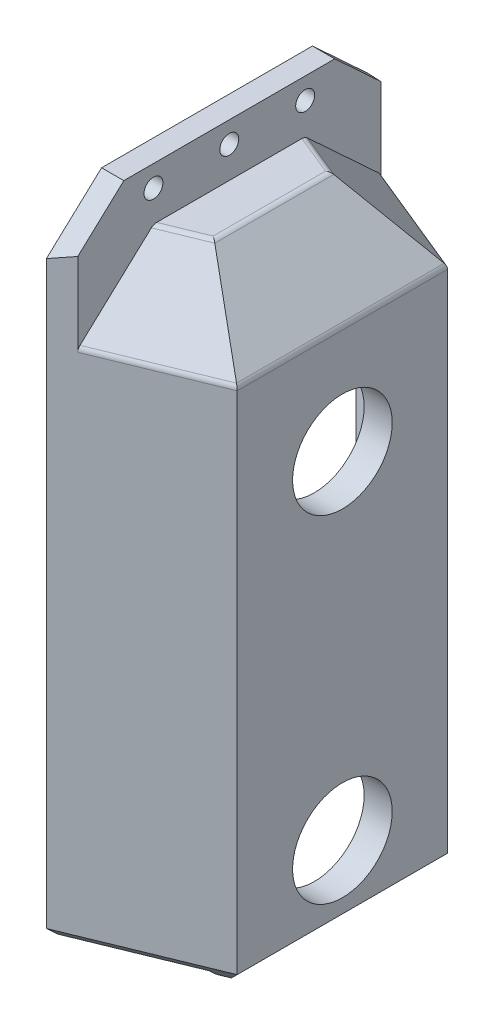
ISO-10303-21;
HEADER;
FILE_DESCRIPTION(('STEP AP214'),'2;1');
FILE_NAME('part.step','',(''),(''),'','','');
FILE_SCHEMA(('AUTOMOTIVE_DESIGN { 1 0 10303 214 1 1 1 1 }'));
ENDSEC;
DATA;
#1=APPLICATION_CONTEXT('core data for automotive mechanical design processes');
#2=APPLICATION_PROTOCOL_DEFINITION('international standard','automotive_design',2000,#1);
#3=PRODUCT_CONTEXT('',#1,'mechanical');
#4=PRODUCT('Part','Part','',(#3));
#5=PRODUCT_RELATED_PRODUCT_CATEGORY('part','',(#4));
#6=PRODUCT_DEFINITION_FORMATION('','',#4);
#7=PRODUCT_DEFINITION_CONTEXT('part definition',#1,'design');
#8=PRODUCT_DEFINITION('design','',#6,#7);
#9=PRODUCT_DEFINITION_SHAPE('','',#8);
#10=(LENGTH_UNIT() NAMED_UNIT(*) SI_UNIT(.MILLI.,.METRE.));
#11=(NAMED_UNIT(*) PLANE_ANGLE_UNIT() SI_UNIT($,.RADIAN.));
#12=(NAMED_UNIT(*) SI_UNIT($,.STERADIAN.) SOLID_ANGLE_UNIT());
#13=UNCERTAINTY_MEASURE_WITH_UNIT(LENGTH_MEASURE(1.E-05),#10,'distance_accuracy_value','');
#14=(GEOMETRIC_REPRESENTATION_CONTEXT(3) GLOBAL_UNCERTAINTY_ASSIGNED_CONTEXT((#13)) GLOBAL_UNIT_ASSIGNED_CONTEXT((#10,
#11,#12)) REPRESENTATION_CONTEXT('',''));
#15=CARTESIAN_POINT('',(0.,0.,0.));
#16=DIRECTION('',(0.,0.,1.));
#17=DIRECTION('',(1.,0.,0.));
#18=AXIS2_PLACEMENT_3D('',#15,#16,#17);
#19=CARTESIAN_POINT('',(3.175,7.5,-19.402609778092));
#20=DIRECTION('',(0.,1.,0.));
#21=DIRECTION('',(0.,0.,1.));
#22=AXIS2_PLACEMENT_3D('',#19,#20,#21);
#23=PLANE('',#22);
#24=DIRECTION('',(0.,0.,1.));
#25=VECTOR('',#24,1.);
#26=CARTESIAN_POINT('',(8.88578643762691,7.5,-19.402609778092));
#27=LINE('',#26,#25);
#28=CARTESIAN_POINT('',(8.88578643762691,7.5,8.01080265694155));
#29=VERTEX_POINT('',#28);
#30=CARTESIAN_POINT('',(8.88578643762691,7.5,-8.01080265694154));
#31=VERTEX_POINT('',#30);
#32=EDGE_CURVE('E309',#29,#31,#27,.F.);
#33=ORIENTED_EDGE('',*,*,#32,.T.);
#34=DIRECTION('',(0.925426676120117,0.,0.378926730549948));
#35=VECTOR('',#34,1.);
#36=CARTESIAN_POINT('',(0.000233412048950173,7.5,-11.6490958291533));
#37=LINE('',#36,#35);
#38=CARTESIAN_POINT('',(3.175,7.5,-10.3491506746921));
#39=VERTEX_POINT('',#38);
#40=EDGE_CURVE('E311',#31,#39,#37,.F.);
#41=ORIENTED_EDGE('',*,*,#40,.T.);
#42=DIRECTION('',(0.,0.,1.));
#43=VECTOR('',#42,1.);
#44=CARTESIAN_POINT('',(3.175,7.5,-19.402609778092));
#45=LINE('',#44,#43);
#46=CARTESIAN_POINT('',(3.175,7.5,10.3491506746921));
#47=VERTEX_POINT('',#46);
#48=EDGE_CURVE('E232',#39,#47,#45,.T.);
#49=ORIENTED_EDGE('',*,*,#48,.T.);
#50=DIRECTION('',(0.925426676120117,0.,-0.378926730549948));
#51=VECTOR('',#50,1.);
#52=CARTESIAN_POINT('',(13.6080172522402,7.5,6.07723025227988));
#53=LINE('',#52,#51);
#54=EDGE_CURVE('E307',#47,#29,#53,.T.);
#55=ORIENTED_EDGE('',*,*,#54,.T.);
#56=EDGE_LOOP('',(#33,#41,#49,#55));
#57=FACE_BOUND('',#56,.T.);
#58=ADVANCED_FACE('F41',(#57),#23,.T.);
#59=CARTESIAN_POINT('',(0.,-2.50000000000004,22.902609778092));
#60=DIRECTION('',(0.267941660744716,0.707106781186546,0.654375478175463));
#61=DIRECTION('',(0.925426676120117,0.,-0.378926730549948));
#62=AXIS2_PLACEMENT_3D('',#59,#60,#61);
#63=PLANE('',#62);
#64=DIRECTION('',(0.,-0.679210724111777,0.733943316783766));
#65=VECTOR('',#64,1.);
#66=CARTESIAN_POINT('',(3.175,-3.14807312601304,22.302865619203));
#67=LINE('',#66,#65);
#68=CARTESIAN_POINT('',(3.175,7.20710678118655,11.1132379864509));
#69=VERTEX_POINT('',#68);
#70=CARTESIAN_POINT('',(3.175,-2.20710678118658,21.2860737229812));
#71=VERTEX_POINT('',#70);
#72=EDGE_CURVE('E237',#69,#71,#67,.T.);
#73=ORIENTED_EDGE('',*,*,#72,.T.);
#74=DIRECTION('',(-0.925426676120117,0.,0.378926730549948));
#75=VECTOR('',#74,1.);
#76=CARTESIAN_POINT('',(19.1890149301948,-2.20710678118658,14.7289488020553));
#77=LINE('',#76,#75);
#78=CARTESIAN_POINT('',(19.0071067811865,-2.20710678118657,14.8034332122661));
#79=VERTEX_POINT('',#78);
#80=EDGE_CURVE('E343',#71,#79,#77,.F.);
#81=ORIENTED_EDGE('',*,*,#80,.T.);
#82=DIRECTION('',(-0.638823976736833,0.638823976736836,-0.428728181360023));
#83=VECTOR('',#82,1.);
#84=CARTESIAN_POINT('',(1.71582840770105,15.084171592299,3.19889330704541));
#85=LINE('',#84,#83);
#86=CARTESIAN_POINT('',(9.59289321881345,7.20710678118655,8.48535686180093));
#87=VERTEX_POINT('',#86);
#88=EDGE_CURVE('E295',#87,#79,#85,.F.);
#89=ORIENTED_EDGE('',*,*,#88,.F.);
#90=DIRECTION('',(0.925426676120117,0.,-0.378926730549948));
#91=VECTOR('',#90,1.);
#92=CARTESIAN_POINT('',(-3.67828223569425,7.20710678118655,13.9193942148355));
#93=LINE('',#92,#91);
#94=EDGE_CURVE('E318',#87,#69,#93,.F.);
#95=ORIENTED_EDGE('',*,*,#94,.T.);
#96=EDGE_LOOP('',(#73,#81,#89,#95));
#97=FACE_BOUND('',#96,.T.);
#98=ADVANCED_FACE('F430',(#97),#63,.T.);
#99=CARTESIAN_POINT('',(0.157190002988433,7.5,-12.0324201093841));
#100=DIRECTION('',(-0.267941660744716,-0.707106781186546,0.654375478175462));
#101=DIRECTION('',(-0.925426676120117,0.,-0.378926730549948));
#102=AXIS2_PLACEMENT_3D('',#99,#100,#101);
#103=PLANE('',#102);
#104=DIRECTION('',(-0.638823976736833,0.638823976736836,0.428728181360024));
#105=VECTOR('',#104,1.);
#106=CARTESIAN_POINT('',(12.3438734094776,4.45612659052238,-10.331597417964));
#107=LINE('',#106,#105);
#108=CARTESIAN_POINT('',(9.59289321881346,7.20710678118655,-8.48535686180092));
#109=VERTEX_POINT('',#108);
#110=CARTESIAN_POINT('',(19.0071067811866,-2.20710678118658,-14.8034332122661));
#111=VERTEX_POINT('',#110);
#112=EDGE_CURVE('E240',#109,#111,#107,.F.);
#113=ORIENTED_EDGE('',*,*,#112,.T.);
#114=DIRECTION('',(0.925426676120117,0.,0.378926730549948));
#115=VECTOR('',#114,1.);
#116=CARTESIAN_POINT('',(3.83547223868268,-2.20710678118659,-21.0156356726406));
#117=LINE('',#116,#115);
#118=CARTESIAN_POINT('',(3.175,-2.20710678118658,-21.2860737229812));
#119=VERTEX_POINT('',#118);
#120=EDGE_CURVE('E334',#111,#119,#117,.F.);
#121=ORIENTED_EDGE('',*,*,#120,.T.);
#122=DIRECTION('',(0.,-0.679210724111777,-0.733943316783766));
#123=VECTOR('',#122,1.);
#124=CARTESIAN_POINT('',(3.175,6.88401210756644,-11.4623684815591));
#125=LINE('',#124,#123);
#126=CARTESIAN_POINT('',(3.175,7.20710678118655,-11.1132379864509));
#127=VERTEX_POINT('',#126);
#128=EDGE_CURVE('E291',#119,#127,#125,.F.);
#129=ORIENTED_EDGE('',*,*,#128,.T.);
#130=DIRECTION('',(-0.925426676120117,0.,-0.378926730549948));
#131=VECTOR('',#130,1.);
#132=CARTESIAN_POINT('',(0.268175072793666,7.20710678118655,-12.3034713073288));
#133=LINE('',#132,#131);
#134=EDGE_CURVE('E314',#127,#109,#133,.F.);
#135=ORIENTED_EDGE('',*,*,#134,.T.);
#136=EDGE_LOOP('',(#113,#121,#129,#135));
#137=FACE_BOUND('',#136,.T.);
#138=ADVANCED_FACE('F450',(#137),#103,.F.);
#139=CARTESIAN_POINT('',(19.3,-2.5,15.));
#140=DIRECTION('',(0.,1.,0.));
#141=DIRECTION('',(0.,0.,1.));
#142=AXIS2_PLACEMENT_3D('',#139,#140,#141);
#143=PLANE('',#142);
#144=DIRECTION('',(0.925426676120117,0.,0.378926730549948));
#145=VECTOR('',#144,1.);
#146=CARTESIAN_POINT('',(13.4053663472503,-2.5,-10.3728666193994));
#147=LINE('',#146,#145);
#148=CARTESIAN_POINT('',(0.,-2.5,-15.8618499963261));
#149=VERTEX_POINT('',#148);
#150=CARTESIAN_POINT('',(10.3,-2.5,-11.6443950370335));
#151=VERTEX_POINT('',#150);
#152=EDGE_CURVE('E276',#149,#151,#147,.T.);
#153=ORIENTED_EDGE('',*,*,#152,.T.);
#154=DIRECTION('',(0.,0.,1.));
#155=VECTOR('',#154,1.);
#156=CARTESIAN_POINT('',(10.3,-2.5,15.));
#157=LINE('',#156,#155);
#158=CARTESIAN_POINT('',(10.3,-2.5,11.6443950370335));
#159=VERTEX_POINT('',#158);
#160=EDGE_CURVE('E274',#151,#159,#157,.T.);
#161=ORIENTED_EDGE('',*,*,#160,.T.);
#162=DIRECTION('',(-0.925426676120117,0.,0.378926730549948));
#163=VECTOR('',#162,1.);
#164=CARTESIAN_POINT('',(-1.89463365274974,-2.5,16.6376298113584));
#165=LINE('',#164,#163);
#166=CARTESIAN_POINT('',(0.,-2.5,15.8618499963261));
#167=VERTEX_POINT('',#166);
#168=EDGE_CURVE('E278',#159,#167,#165,.T.);
#169=ORIENTED_EDGE('',*,*,#168,.T.);
#170=DIRECTION('',(0.,0.,-1.));
#171=VECTOR('',#170,1.);
#172=CARTESIAN_POINT('',(0.,-2.5,15.));
#173=LINE('',#172,#171);
#174=EDGE_CURVE('E264',#167,#149,#173,.T.);
#175=ORIENTED_EDGE('',*,*,#174,.T.);
#176=EDGE_LOOP('',(#153,#161,#169,#175));
#177=FACE_BOUND('',#176,.T.);
#178=ADVANCED_FACE('F482',(#177),#143,.F.);
#179=CARTESIAN_POINT('',(19.3,0.,0.));
#180=DIRECTION('',(1.,0.,0.));
#181=DIRECTION('',(0.,0.,-1.));
#182=AXIS2_PLACEMENT_3D('',#179,#180,#181);
#183=PLANE('',#182);
#184=CARTESIAN_POINT('',(19.3,-17.9000000000868,-2.03531101694576E-06));
#185=DIRECTION('',(1.,0.,0.));
#186=DIRECTION('',(0.,0.,-1.));
#187=AXIS2_PLACEMENT_3D('',#184,#185,#186);
#188=CIRCLE('',#187,7.1);
#189=CARTESIAN_POINT('',(19.3,-17.9000000000868,-7.10000203531102));
#190=VERTEX_POINT('',#189);
#191=EDGE_CURVE('E247',#190,#190,#188,.T.);
#192=ORIENTED_EDGE('',*,*,#191,.F.);
#193=EDGE_LOOP('',(#192));
#194=FACE_BOUND('',#193,.T.);
#195=CARTESIAN_POINT('',(19.3,-65.9000000000868,1.30200223754135E-07));
#196=DIRECTION('',(1.,0.,0.));
#197=DIRECTION('',(0.,0.,-1.));
#198=AXIS2_PLACEMENT_3D('',#195,#196,#197);
#199=CIRCLE('',#198,7.1);
#200=CARTESIAN_POINT('',(19.3,-65.9000000000868,-7.09999986979977));
#201=VERTEX_POINT('',#200);
#202=EDGE_CURVE('E251',#201,#201,#199,.T.);
#203=ORIENTED_EDGE('',*,*,#202,.F.);
#204=EDGE_LOOP('',(#203));
#205=FACE_BOUND('',#204,.T.);
#206=DIRECTION('',(0.,-1.,0.));
#207=VECTOR('',#206,1.);
#208=CARTESIAN_POINT('',(19.3,2.5,15.));
#209=LINE('',#208,#207);
#210=CARTESIAN_POINT('',(19.3,-2.91421356237313,15.));
#211=VERTEX_POINT('',#210);
#212=CARTESIAN_POINT('',(19.3,-75.,15.));
#213=VERTEX_POINT('',#212);
#214=EDGE_CURVE('E265',#211,#213,#209,.T.);
#215=ORIENTED_EDGE('',*,*,#214,.T.);
#216=DIRECTION('',(0.,0.,-1.));
#217=VECTOR('',#216,1.);
#218=CARTESIAN_POINT('',(19.3,-75.,-15.));
#219=LINE('',#218,#217);
#220=CARTESIAN_POINT('',(19.3,-75.,-15.));
#221=VERTEX_POINT('',#220);
#222=EDGE_CURVE('E371',#213,#221,#219,.T.);
#223=ORIENTED_EDGE('',*,*,#222,.T.);
#224=DIRECTION('',(0.,1.,0.));
#225=VECTOR('',#224,1.);
#226=CARTESIAN_POINT('',(19.3,2.5,-15.));
#227=LINE('',#226,#225);
#228=CARTESIAN_POINT('',(19.3,-2.91421356237313,-15.));
#229=VERTEX_POINT('',#228);
#230=EDGE_CURVE('E267',#221,#229,#227,.T.);
#231=ORIENTED_EDGE('',*,*,#230,.T.);
#232=DIRECTION('',(0.,0.,-1.));
#233=VECTOR('',#232,1.);
#234=CARTESIAN_POINT('',(19.3,-2.91421356237313,0.));
#235=LINE('',#234,#233);
#236=EDGE_CURVE('E336',#229,#211,#235,.F.);
#237=ORIENTED_EDGE('',*,*,#236,.T.);
#238=EDGE_LOOP('',(#215,#223,#231,#237));
#239=FACE_BOUND('',#238,.T.);
#240=ADVANCED_FACE('F419',(#194,#205,#239),#183,.T.);
#241=CARTESIAN_POINT('',(0.,0.,0.));
#242=DIRECTION('',(1.,0.,0.));
#243=DIRECTION('',(0.,0.,-1.));
#244=AXIS2_PLACEMENT_3D('',#241,#242,#243);
#245=PLANE('',#244);
#246=CARTESIAN_POINT('',(0.,11.9609325831868,-10.8186055606053));
#247=DIRECTION('',(1.,0.,0.));
#248=DIRECTION('',(0.,0.,-1.));
#249=AXIS2_PLACEMENT_3D('',#246,#247,#248);
#250=CIRCLE('',#249,1.35);
#251=CARTESIAN_POINT('',(0.,11.9609325831868,-12.1686055606053));
#252=VERTEX_POINT('',#251);
#253=EDGE_CURVE('E388',#252,#252,#250,.T.);
#254=ORIENTED_EDGE('',*,*,#253,.T.);
#255=EDGE_LOOP('',(#254));
#256=FACE_BOUND('',#255,.T.);
#257=CARTESIAN_POINT('',(0.,11.9609325831868,10.8186055606053));
#258=DIRECTION('',(1.,0.,0.));
#259=DIRECTION('',(0.,0.,-1.));
#260=AXIS2_PLACEMENT_3D('',#257,#258,#259);
#261=CIRCLE('',#260,1.35);
#262=CARTESIAN_POINT('',(0.,11.9609325831868,9.46860556060531));
#263=VERTEX_POINT('',#262);
#264=EDGE_CURVE('E790',#263,#263,#261,.T.);
#265=ORIENTED_EDGE('',*,*,#264,.T.);
#266=EDGE_LOOP('',(#265));
#267=FACE_BOUND('',#266,.T.);
#268=CARTESIAN_POINT('',(0.,11.9609325831868,0.));
#269=DIRECTION('',(1.,0.,0.));
#270=DIRECTION('',(0.,0.,-1.));
#271=AXIS2_PLACEMENT_3D('',#268,#269,#270);
#272=CIRCLE('',#271,1.35);
#273=CARTESIAN_POINT('',(0.,11.9609325831868,-1.35));
#274=VERTEX_POINT('',#273);
#275=EDGE_CURVE('E375',#274,#274,#272,.T.);
#276=ORIENTED_EDGE('',*,*,#275,.T.);
#277=EDGE_LOOP('',(#276));
#278=FACE_BOUND('',#277,.T.);
#279=DIRECTION('',(0.,1.,0.));
#280=VECTOR('',#279,1.);
#281=CARTESIAN_POINT('',(0.,-23.3552449351427,-22.902609778092));
#282=LINE('',#281,#280);
#283=CARTESIAN_POINT('',(0.,-75.,-22.902609778092));
#284=VERTEX_POINT('',#283);
#285=CARTESIAN_POINT('',(0.,7.71877279687747,-22.902609778092));
#286=VERTEX_POINT('',#285);
#287=EDGE_CURVE('E194',#284,#286,#282,.T.);
#288=ORIENTED_EDGE('',*,*,#287,.F.);
#289=DIRECTION('',(0.,-0.67921072411178,0.733943316783763));
#290=VECTOR('',#289,1.);
#291=CARTESIAN_POINT('',(0.,-75.,-22.902609778092));
#292=LINE('',#291,#290);
#293=CARTESIAN_POINT('',(0.,-76.5157069221998,-21.2647631919589));
#294=VERTEX_POINT('',#293);
#295=EDGE_CURVE('E358',#284,#294,#292,.T.);
#296=ORIENTED_EDGE('',*,*,#295,.T.);
#297=DIRECTION('',(0.,1.,0.));
#298=VECTOR('',#297,1.);
#299=CARTESIAN_POINT('',(0.,-98.3552449351427,-21.2647631919589));
#300=LINE('',#299,#298);
#301=CARTESIAN_POINT('',(0.,-7.50000000000005,-21.2647631919589));
#302=VERTEX_POINT('',#301);
#303=EDGE_CURVE('E241',#294,#302,#300,.T.);
#304=ORIENTED_EDGE('',*,*,#303,.T.);
#305=DIRECTION('',(0.,-0.67921072411178,-0.733943316783763));
#306=VECTOR('',#305,1.);
#307=CARTESIAN_POINT('',(0.,6.5604846889215,-6.07124753940561));
#308=LINE('',#307,#306);
#309=EDGE_CURVE('E289',#302,#149,#308,.F.);
#310=ORIENTED_EDGE('',*,*,#309,.T.);
#311=ORIENTED_EDGE('',*,*,#174,.F.);
#312=DIRECTION('',(0.,0.67921072411178,-0.733943316783763));
#313=VECTOR('',#312,1.);
#314=CARTESIAN_POINT('',(0.,6.5604846889215,6.07124753940561));
#315=LINE('',#314,#313);
#316=CARTESIAN_POINT('',(0.,-7.50000000000005,21.2647631919589));
#317=VERTEX_POINT('',#316);
#318=EDGE_CURVE('E286',#167,#317,#315,.F.);
#319=ORIENTED_EDGE('',*,*,#318,.T.);
#320=DIRECTION('',(0.,1.,0.));
#321=VECTOR('',#320,1.);
#322=CARTESIAN_POINT('',(0.,-98.3552449351427,21.2647631919589));
#323=LINE('',#322,#321);
#324=CARTESIAN_POINT('',(0.,-76.5157069221998,21.2647631919589));
#325=VERTEX_POINT('',#324);
#326=EDGE_CURVE('E243',#325,#317,#323,.T.);
#327=ORIENTED_EDGE('',*,*,#326,.F.);
#328=DIRECTION('',(0.,-0.67921072411178,-0.733943316783763));
#329=VECTOR('',#328,1.);
#330=CARTESIAN_POINT('',(0.,-75.,22.902609778092));
#331=LINE('',#330,#329);
#332=CARTESIAN_POINT('',(0.,-75.,22.902609778092));
#333=VERTEX_POINT('',#332);
#334=EDGE_CURVE('E356',#325,#333,#331,.F.);
#335=ORIENTED_EDGE('',*,*,#334,.T.);
#336=DIRECTION('',(0.,1.,0.));
#337=VECTOR('',#336,1.);
#338=CARTESIAN_POINT('',(0.,-23.3552449351427,22.902609778092));
#339=LINE('',#338,#337);
#340=CARTESIAN_POINT('',(0.,7.71877279687747,22.902609778092));
#341=VERTEX_POINT('',#340);
#342=EDGE_CURVE('E205',#333,#341,#339,.T.);
#343=ORIENTED_EDGE('',*,*,#342,.T.);
#344=DIRECTION('',(0.,0.679210724111777,-0.733943316783766));
#345=VECTOR('',#344,1.);
#346=CARTESIAN_POINT('',(0.,7.71877279687747,22.902609778092));
#347=LINE('',#346,#345);
#348=CARTESIAN_POINT('',(0.,15.,15.0346420708617));
#349=VERTEX_POINT('',#348);
#350=EDGE_CURVE('E226',#341,#349,#347,.T.);
#351=ORIENTED_EDGE('',*,*,#350,.T.);
#352=DIRECTION('',(0.,0.,-1.));
#353=VECTOR('',#352,1.);
#354=CARTESIAN_POINT('',(0.,15.,15.0346420708617));
#355=LINE('',#354,#353);
#356=CARTESIAN_POINT('',(0.,15.,-15.0346420708617));
#357=VERTEX_POINT('',#356);
#358=EDGE_CURVE('E221',#349,#357,#355,.T.);
#359=ORIENTED_EDGE('',*,*,#358,.T.);
#360=DIRECTION('',(0.,-0.679210724111777,-0.733943316783766));
#361=VECTOR('',#360,1.);
#362=CARTESIAN_POINT('',(0.,15.,-15.0346420708617));
#363=LINE('',#362,#361);
#364=EDGE_CURVE('E211',#357,#286,#363,.T.);
#365=ORIENTED_EDGE('',*,*,#364,.T.);
#366=EDGE_LOOP('',(#288,#296,#304,#310,#311,#319,#327,#335,#343,#351,#359,#365));
#367=FACE_BOUND('',#366,.T.);
#368=ADVANCED_FACE('F218',(#256,#267,#278,#367),#245,.F.);
#369=CARTESIAN_POINT('',(15.3,-77.5,15.));
#370=DIRECTION('',(1.,0.,0.));
#371=DIRECTION('',(0.,0.,-1.));
#372=AXIS2_PLACEMENT_3D('',#369,#370,#371);
#373=PLANE('',#372);
#374=CARTESIAN_POINT('',(15.3,-17.9000000000868,-2.03531101694576E-06));
#375=DIRECTION('',(1.,0.,0.));
#376=DIRECTION('',(0.,0.,-1.));
#377=AXIS2_PLACEMENT_3D('',#374,#375,#376);
#378=CIRCLE('',#377,7.1);
#379=CARTESIAN_POINT('',(15.3,-17.9000000000868,-7.10000203531102));
#380=VERTEX_POINT('',#379);
#381=EDGE_CURVE('E250',#380,#380,#378,.F.);
#382=ORIENTED_EDGE('',*,*,#381,.F.);
#383=EDGE_LOOP('',(#382));
#384=FACE_BOUND('',#383,.T.);
#385=CARTESIAN_POINT('',(15.3,-65.9000000000868,1.30200223754135E-07));
#386=DIRECTION('',(1.,0.,0.));
#387=DIRECTION('',(0.,0.,-1.));
#388=AXIS2_PLACEMENT_3D('',#385,#386,#387);
#389=CIRCLE('',#388,7.1);
#390=CARTESIAN_POINT('',(15.3,-65.9000000000868,-7.09999986979977));
#391=VERTEX_POINT('',#390);
#392=EDGE_CURVE('E204',#391,#391,#389,.F.);
#393=ORIENTED_EDGE('',*,*,#392,.F.);
#394=EDGE_LOOP('',(#393));
#395=FACE_BOUND('',#394,.T.);
#396=DIRECTION('',(0.,1.,0.));
#397=VECTOR('',#396,1.);
#398=CARTESIAN_POINT('',(15.3,-77.5,-15.));
#399=LINE('',#398,#397);
#400=CARTESIAN_POINT('',(15.3,-76.5157069221998,-15.));
#401=VERTEX_POINT('',#400);
#402=CARTESIAN_POINT('',(15.3,-7.50000000000005,-15.));
#403=VERTEX_POINT('',#402);
#404=EDGE_CURVE('E260',#401,#403,#399,.T.);
#405=ORIENTED_EDGE('',*,*,#404,.F.);
#406=DIRECTION('',(0.,-0.67921072411178,0.733943316783763));
#407=VECTOR('',#406,1.);
#408=CARTESIAN_POINT('',(15.3,-71.8770019439373,-20.0125040675403));
#409=LINE('',#408,#407);
#410=CARTESIAN_POINT('',(15.3,-77.5,-13.9363899883166));
#411=VERTEX_POINT('',#410);
#412=EDGE_CURVE('E364',#401,#411,#409,.T.);
#413=ORIENTED_EDGE('',*,*,#412,.T.);
#414=DIRECTION('',(0.,0.,-1.));
#415=VECTOR('',#414,1.);
#416=CARTESIAN_POINT('',(15.3,-77.5,15.));
#417=LINE('',#416,#415);
#418=CARTESIAN_POINT('',(15.3,-77.5,13.9363899883166));
#419=VERTEX_POINT('',#418);
#420=EDGE_CURVE('E254',#419,#411,#417,.T.);
#421=ORIENTED_EDGE('',*,*,#420,.F.);
#422=DIRECTION('',(0.,-0.67921072411178,-0.733943316783763));
#423=VECTOR('',#422,1.);
#424=CARTESIAN_POINT('',(15.3,-71.8770019439373,20.0125040675403));
#425=LINE('',#424,#423);
#426=CARTESIAN_POINT('',(15.3,-76.5157069221998,15.));
#427=VERTEX_POINT('',#426);
#428=EDGE_CURVE('E362',#419,#427,#425,.F.);
#429=ORIENTED_EDGE('',*,*,#428,.T.);
#430=DIRECTION('',(0.,1.,0.));
#431=VECTOR('',#430,1.);
#432=CARTESIAN_POINT('',(15.3,-77.5,15.));
#433=LINE('',#432,#431);
#434=CARTESIAN_POINT('',(15.3,-7.50000000000005,15.));
#435=VERTEX_POINT('',#434);
#436=EDGE_CURVE('E262',#427,#435,#433,.T.);
#437=ORIENTED_EDGE('',*,*,#436,.T.);
#438=DIRECTION('',(0.,0.,-1.));
#439=VECTOR('',#438,1.);
#440=CARTESIAN_POINT('',(15.3,-7.50000000000005,-15.));
#441=LINE('',#440,#439);
#442=EDGE_CURVE('E283',#435,#403,#441,.T.);
#443=ORIENTED_EDGE('',*,*,#442,.T.);
#444=EDGE_LOOP('',(#405,#413,#421,#429,#437,#443));
#445=FACE_BOUND('',#444,.T.);
#446=ADVANCED_FACE('F478',(#384,#395,#445),#373,.F.);
#447=CARTESIAN_POINT('',(0.,-77.5,0.));
#448=DIRECTION('',(0.,1.,0.));
#449=DIRECTION('',(0.,0.,1.));
#450=AXIS2_PLACEMENT_3D('',#447,#448,#449);
#451=PLANE('',#450);
#452=ORIENTED_EDGE('',*,*,#420,.T.);
#453=DIRECTION('',(0.925426676120117,0.,0.378926730549948));
#454=VECTOR('',#453,1.);
#455=CARTESIAN_POINT('',(18.3526831736251,-77.5,-12.6864333096997));
#456=LINE('',#455,#454);
#457=CARTESIAN_POINT('',(16.8,-77.5,-13.3221975185167));
#458=VERTEX_POINT('',#457);
#459=EDGE_CURVE('E66',#411,#458,#456,.T.);
#460=ORIENTED_EDGE('',*,*,#459,.T.);
#461=DIRECTION('',(0.,0.,1.));
#462=VECTOR('',#461,1.);
#463=CARTESIAN_POINT('',(16.8,-77.5,15.));
#464=LINE('',#463,#462);
#465=CARTESIAN_POINT('',(16.8,-77.5,13.3221975185167));
#466=VERTEX_POINT('',#465);
#467=EDGE_CURVE('E368',#458,#466,#464,.T.);
#468=ORIENTED_EDGE('',*,*,#467,.T.);
#469=DIRECTION('',(-0.925426676120117,0.,0.378926730549948));
#470=VECTOR('',#469,1.);
#471=CARTESIAN_POINT('',(7.08391626033141,-77.5,17.3005611644165));
#472=LINE('',#471,#470);
#473=EDGE_CURVE('E366',#466,#419,#472,.T.);
#474=ORIENTED_EDGE('',*,*,#473,.T.);
#475=EDGE_LOOP('',(#452,#460,#468,#474));
#476=FACE_BOUND('',#475,.T.);
#477=ADVANCED_FACE('F714',(#476),#451,.F.);
#478=CARTESIAN_POINT('',(-0.001000000000001,-65.9000000000868,1.30200223754135E-07));
#479=DIRECTION('',(1.,0.,0.));
#480=DIRECTION('',(0.,0.,-1.));
#481=AXIS2_PLACEMENT_3D('',#478,#479,#480);
#482=CYLINDRICAL_SURFACE('',#481,7.1);
#483=ORIENTED_EDGE('',*,*,#202,.T.);
#484=EDGE_LOOP('',(#483));
#485=FACE_BOUND('',#484,.T.);
#486=ORIENTED_EDGE('',*,*,#392,.T.);
#487=EDGE_LOOP('',(#486));
#488=FACE_BOUND('',#487,.T.);
#489=ADVANCED_FACE('F722',(#485,#488),#482,.F.);
#490=CARTESIAN_POINT('',(-0.001000000000001,-17.9000000000868,-2.03531101694576E-06));
#491=DIRECTION('',(1.,0.,0.));
#492=DIRECTION('',(0.,0.,-1.));
#493=AXIS2_PLACEMENT_3D('',#490,#491,#492);
#494=CYLINDRICAL_SURFACE('',#493,7.1);
#495=ORIENTED_EDGE('',*,*,#191,.T.);
#496=EDGE_LOOP('',(#495));
#497=FACE_BOUND('',#496,.T.);
#498=ORIENTED_EDGE('',*,*,#381,.T.);
#499=EDGE_LOOP('',(#498));
#500=FACE_BOUND('',#499,.T.);
#501=ADVANCED_FACE('F561',(#497,#500),#494,.F.);
#502=CARTESIAN_POINT('',(0.,-23.3552449351427,-22.902609778092));
#503=DIRECTION('',(0.378926730549948,0.,-0.925426676120117));
#504=DIRECTION('',(-0.925426676120117,0.,-0.378926730549948));
#505=AXIS2_PLACEMENT_3D('',#502,#503,#504);
#506=PLANE('',#505);
#507=ORIENTED_EDGE('',*,*,#230,.F.);
#508=DIRECTION('',(-0.925426676120117,0.,-0.378926730549948));
#509=VECTOR('',#508,1.);
#510=CARTESIAN_POINT('',(0.,-75.,-22.902609778092));
#511=LINE('',#510,#509);
#512=EDGE_CURVE('E201',#221,#284,#511,.T.);
#513=ORIENTED_EDGE('',*,*,#512,.T.);
#514=ORIENTED_EDGE('',*,*,#287,.T.);
#515=DIRECTION('',(0.873289406927855,0.330912699791077,0.357578518460737));
#516=VECTOR('',#515,1.);
#517=CARTESIAN_POINT('',(6.98243842213033,10.3646053594417,-20.0435690449494));
#518=LINE('',#517,#516);
#519=CARTESIAN_POINT('',(3.175,8.92186516637356,-21.6025690503489));
#520=VERTEX_POINT('',#519);
#521=EDGE_CURVE('E198',#286,#520,#518,.T.);
#522=ORIENTED_EDGE('',*,*,#521,.T.);
#523=DIRECTION('',(0.,1.,0.));
#524=VECTOR('',#523,1.);
#525=CARTESIAN_POINT('',(3.175,0.,-21.6025690503489));
#526=LINE('',#525,#524);
#527=CARTESIAN_POINT('',(3.175,-2.91421356237313,-21.6025690503489));
#528=VERTEX_POINT('',#527);
#529=EDGE_CURVE('E303',#528,#520,#526,.T.);
#530=ORIENTED_EDGE('',*,*,#529,.F.);
#531=DIRECTION('',(-0.925426676120117,0.,-0.378926730549948));
#532=VECTOR('',#531,1.);
#533=CARTESIAN_POINT('',(0.,-2.91421356237313,-22.902609778092));
#534=LINE('',#533,#532);
#535=EDGE_CURVE('E325',#528,#229,#534,.F.);
#536=ORIENTED_EDGE('',*,*,#535,.T.);
#537=EDGE_LOOP('',(#507,#513,#514,#522,#530,#536));
#538=FACE_BOUND('',#537,.T.);
#539=ADVANCED_FACE('F197',(#538),#506,.T.);
#540=CARTESIAN_POINT('',(0.,-23.3552449351427,22.902609778092));
#541=DIRECTION('',(-0.378926730549948,0.,-0.925426676120117));
#542=DIRECTION('',(-0.925426676120117,0.,0.378926730549948));
#543=AXIS2_PLACEMENT_3D('',#540,#541,#542);
#544=PLANE('',#543);
#545=ORIENTED_EDGE('',*,*,#342,.F.);
#546=DIRECTION('',(0.925426676120117,0.,-0.378926730549948));
#547=VECTOR('',#546,1.);
#548=CARTESIAN_POINT('',(0.,-75.,22.902609778092));
#549=LINE('',#548,#547);
#550=EDGE_CURVE('E51',#333,#213,#549,.T.);
#551=ORIENTED_EDGE('',*,*,#550,.T.);
#552=ORIENTED_EDGE('',*,*,#214,.F.);
#553=DIRECTION('',(-0.925426676120117,0.,0.378926730549948));
#554=VECTOR('',#553,1.);
#555=CARTESIAN_POINT('',(3.175,-2.91421356237313,21.6025690503489));
#556=LINE('',#555,#554);
#557=CARTESIAN_POINT('',(3.175,-2.91421356237313,21.6025690503489));
#558=VERTEX_POINT('',#557);
#559=EDGE_CURVE('E340',#211,#558,#556,.T.);
#560=ORIENTED_EDGE('',*,*,#559,.T.);
#561=DIRECTION('',(0.,-1.,0.));
#562=VECTOR('',#561,1.);
#563=CARTESIAN_POINT('',(3.175,0.,21.6025690503489));
#564=LINE('',#563,#562);
#565=CARTESIAN_POINT('',(3.175,8.92186516637355,21.6025690503489));
#566=VERTEX_POINT('',#565);
#567=EDGE_CURVE('E305',#566,#558,#564,.T.);
#568=ORIENTED_EDGE('',*,*,#567,.F.);
#569=DIRECTION('',(-0.873289406927857,-0.330912699791075,0.357578518460735));
#570=VECTOR('',#569,1.);
#571=CARTESIAN_POINT('',(2.4213641827014,8.63629241009925,21.9111540129864));
#572=LINE('',#571,#570);
#573=EDGE_CURVE('E215',#566,#341,#572,.T.);
#574=ORIENTED_EDGE('',*,*,#573,.T.);
#575=EDGE_LOOP('',(#545,#551,#552,#560,#568,#574));
#576=FACE_BOUND('',#575,.T.);
#577=ADVANCED_FACE('F422',(#576),#544,.F.);
#578=CARTESIAN_POINT('',(15.3,-98.3552449351427,15.));
#579=DIRECTION('',(0.378926730549948,0.,0.925426676120117));
#580=DIRECTION('',(0.925426676120117,0.,-0.378926730549948));
#581=AXIS2_PLACEMENT_3D('',#578,#579,#580);
#582=PLANE('',#581);
#583=ORIENTED_EDGE('',*,*,#436,.F.);
#584=DIRECTION('',(0.925426676120117,0.,-0.378926730549948));
#585=VECTOR('',#584,1.);
#586=CARTESIAN_POINT('',(-0.574341868501091,-76.5157069221998,21.4999341591084));
#587=LINE('',#586,#585);
#588=EDGE_CURVE('E11',#427,#325,#587,.F.);
#589=ORIENTED_EDGE('',*,*,#588,.T.);
#590=ORIENTED_EDGE('',*,*,#326,.T.);
#591=DIRECTION('',(0.925426676120117,0.,-0.378926730549948));
#592=VECTOR('',#591,1.);
#593=CARTESIAN_POINT('',(15.3,-7.50000000000005,15.));
#594=LINE('',#593,#592);
#595=EDGE_CURVE('E269',#317,#435,#594,.T.);
#596=ORIENTED_EDGE('',*,*,#595,.T.);
#597=EDGE_LOOP('',(#583,#589,#590,#596));
#598=FACE_BOUND('',#597,.T.);
#599=ADVANCED_FACE('F548',(#598),#582,.F.);
#600=CARTESIAN_POINT('',(15.3,-98.3552449351427,-15.));
#601=DIRECTION('',(0.378926730549948,0.,-0.925426676120117));
#602=DIRECTION('',(-0.925426676120117,0.,-0.378926730549948));
#603=AXIS2_PLACEMENT_3D('',#600,#601,#602);
#604=PLANE('',#603);
#605=ORIENTED_EDGE('',*,*,#303,.F.);
#606=DIRECTION('',(0.925426676120117,0.,0.378926730549948));
#607=VECTOR('',#606,1.);
#608=CARTESIAN_POINT('',(-0.574341868501091,-76.5157069221998,-21.4999341591084));
#609=LINE('',#608,#607);
#610=EDGE_CURVE('E360',#294,#401,#609,.T.);
#611=ORIENTED_EDGE('',*,*,#610,.T.);
#612=ORIENTED_EDGE('',*,*,#404,.T.);
#613=DIRECTION('',(-0.925426676120117,0.,-0.378926730549948));
#614=VECTOR('',#613,1.);
#615=CARTESIAN_POINT('',(0.,-7.50000000000005,-21.2647631919589));
#616=LINE('',#615,#614);
#617=EDGE_CURVE('E280',#403,#302,#616,.T.);
#618=ORIENTED_EDGE('',*,*,#617,.T.);
#619=EDGE_LOOP('',(#605,#611,#612,#618));
#620=FACE_BOUND('',#619,.T.);
#621=ADVANCED_FACE('F505',(#620),#604,.F.);
#622=CARTESIAN_POINT('',(15.3,-7.50000000000005,-15.));
#623=DIRECTION('',(-0.267941660744717,-0.707106781186543,0.654375478175465));
#624=DIRECTION('',(0.925426676120117,0.,0.378926730549948));
#625=AXIS2_PLACEMENT_3D('',#622,#623,#624);
#626=PLANE('',#625);
#627=ORIENTED_EDGE('',*,*,#309,.F.);
#628=ORIENTED_EDGE('',*,*,#617,.F.);
#629=DIRECTION('',(0.638823976736831,-0.638823976736838,-0.428728181360022));
#630=VECTOR('',#629,1.);
#631=CARTESIAN_POINT('',(15.3,-7.50000000000005,-15.));
#632=LINE('',#631,#630);
#633=EDGE_CURVE('E245',#151,#403,#632,.T.);
#634=ORIENTED_EDGE('',*,*,#633,.F.);
#635=ORIENTED_EDGE('',*,*,#152,.F.);
#636=EDGE_LOOP('',(#627,#628,#634,#635));
#637=FACE_BOUND('',#636,.T.);
#638=ADVANCED_FACE('F500',(#637),#626,.T.);
#639=CARTESIAN_POINT('',(15.3,-7.50000000000005,15.));
#640=DIRECTION('',(-0.707106781186551,-0.707106781186543,0.));
#641=DIRECTION('',(0.,0.,1.));
#642=AXIS2_PLACEMENT_3D('',#639,#640,#641);
#643=PLANE('',#642);
#644=ORIENTED_EDGE('',*,*,#633,.T.);
#645=ORIENTED_EDGE('',*,*,#442,.F.);
#646=DIRECTION('',(-0.638823976736831,0.638823976736838,-0.428728181360022));
#647=VECTOR('',#646,1.);
#648=CARTESIAN_POINT('',(15.3,-7.50000000000005,15.));
#649=LINE('',#648,#647);
#650=EDGE_CURVE('E292',#159,#435,#649,.F.);
#651=ORIENTED_EDGE('',*,*,#650,.F.);
#652=ORIENTED_EDGE('',*,*,#160,.F.);
#653=EDGE_LOOP('',(#644,#645,#651,#652));
#654=FACE_BOUND('',#653,.T.);
#655=ADVANCED_FACE('F463',(#654),#643,.T.);
#656=CARTESIAN_POINT('',(15.3,-7.50000000000005,15.));
#657=DIRECTION('',(-0.267941660744717,-0.707106781186543,-0.654375478175465));
#658=DIRECTION('',(-0.925426676120117,0.,0.378926730549948));
#659=AXIS2_PLACEMENT_3D('',#656,#657,#658);
#660=PLANE('',#659);
#661=ORIENTED_EDGE('',*,*,#318,.F.);
#662=ORIENTED_EDGE('',*,*,#168,.F.);
#663=ORIENTED_EDGE('',*,*,#650,.T.);
#664=ORIENTED_EDGE('',*,*,#595,.F.);
#665=EDGE_LOOP('',(#661,#662,#663,#664));
#666=FACE_BOUND('',#665,.T.);
#667=ADVANCED_FACE('F454',(#666),#660,.T.);
#668=CARTESIAN_POINT('',(9.30000000000001,7.5,-19.402609778092));
#669=DIRECTION('',(-0.707106781186549,-0.707106781186546,0.));
#670=DIRECTION('',(0.,0.,-1.));
#671=AXIS2_PLACEMENT_3D('',#668,#669,#670);
#672=PLANE('',#671);
#673=ORIENTED_EDGE('',*,*,#88,.T.);
#674=DIRECTION('',(0.,0.,1.));
#675=VECTOR('',#674,1.);
#676=CARTESIAN_POINT('',(19.0071067811866,-2.20710678118658,-19.402609778092));
#677=LINE('',#676,#675);
#678=EDGE_CURVE('E338',#79,#111,#677,.F.);
#679=ORIENTED_EDGE('',*,*,#678,.T.);
#680=ORIENTED_EDGE('',*,*,#112,.F.);
#681=DIRECTION('',(0.,0.,-1.));
#682=VECTOR('',#681,1.);
#683=CARTESIAN_POINT('',(9.59289321881346,7.20710678118655,-19.402609778092));
#684=LINE('',#683,#682);
#685=EDGE_CURVE('E316',#109,#87,#684,.F.);
#686=ORIENTED_EDGE('',*,*,#685,.T.);
#687=EDGE_LOOP('',(#673,#679,#680,#686));
#688=FACE_BOUND('',#687,.T.);
#689=ADVANCED_FACE('F452',(#688),#672,.F.);
#690=CARTESIAN_POINT('',(3.175,15.,-15.0346420708617));
#691=DIRECTION('',(0.,0.733943316783766,-0.679210724111777));
#692=DIRECTION('',(0.,0.679210724111777,0.733943316783766));
#693=AXIS2_PLACEMENT_3D('',#690,#691,#692);
#694=PLANE('',#693);
#695=ORIENTED_EDGE('',*,*,#521,.F.);
#696=ORIENTED_EDGE('',*,*,#364,.F.);
#697=DIRECTION('',(-1.,0.,0.));
#698=VECTOR('',#697,1.);
#699=CARTESIAN_POINT('',(3.175,15.,-15.0346420708617));
#700=LINE('',#699,#698);
#701=CARTESIAN_POINT('',(3.175,15.,-15.0346420708617));
#702=VERTEX_POINT('',#701);
#703=EDGE_CURVE('E230',#702,#357,#700,.T.);
#704=ORIENTED_EDGE('',*,*,#703,.F.);
#705=DIRECTION('',(0.,-0.679210724111777,-0.733943316783766));
#706=VECTOR('',#705,1.);
#707=CARTESIAN_POINT('',(3.175,15.,-15.0346420708617));
#708=LINE('',#707,#706);
#709=EDGE_CURVE('E214',#702,#520,#708,.T.);
#710=ORIENTED_EDGE('',*,*,#709,.T.);
#711=EDGE_LOOP('',(#695,#696,#704,#710));
#712=FACE_BOUND('',#711,.T.);
#713=ADVANCED_FACE('F210',(#712),#694,.T.);
#714=CARTESIAN_POINT('',(3.175,15.,15.0346420708617));
#715=DIRECTION('',(0.,1.,0.));
#716=DIRECTION('',(0.,0.,1.));
#717=AXIS2_PLACEMENT_3D('',#714,#715,#716);
#718=PLANE('',#717);
#719=ORIENTED_EDGE('',*,*,#358,.F.);
#720=DIRECTION('',(-1.,0.,0.));
#721=VECTOR('',#720,1.);
#722=CARTESIAN_POINT('',(3.175,15.,15.0346420708617));
#723=LINE('',#722,#721);
#724=CARTESIAN_POINT('',(3.175,15.,15.0346420708617));
#725=VERTEX_POINT('',#724);
#726=EDGE_CURVE('E233',#725,#349,#723,.T.);
#727=ORIENTED_EDGE('',*,*,#726,.F.);
#728=DIRECTION('',(0.,0.,-1.));
#729=VECTOR('',#728,1.);
#730=CARTESIAN_POINT('',(3.175,15.,15.0346420708617));
#731=LINE('',#730,#729);
#732=EDGE_CURVE('E224',#725,#702,#731,.T.);
#733=ORIENTED_EDGE('',*,*,#732,.T.);
#734=ORIENTED_EDGE('',*,*,#703,.T.);
#735=EDGE_LOOP('',(#719,#727,#733,#734));
#736=FACE_BOUND('',#735,.T.);
#737=ADVANCED_FACE('F403',(#736),#718,.T.);
#738=CARTESIAN_POINT('',(3.175,7.71877279687747,22.902609778092));
#739=DIRECTION('',(0.,0.733943316783766,0.679210724111777));
#740=DIRECTION('',(0.,-0.679210724111777,0.733943316783766));
#741=AXIS2_PLACEMENT_3D('',#738,#739,#740);
#742=PLANE('',#741);
#743=ORIENTED_EDGE('',*,*,#573,.F.);
#744=DIRECTION('',(0.,0.679210724111777,-0.733943316783766));
#745=VECTOR('',#744,1.);
#746=CARTESIAN_POINT('',(3.175,7.71877279687747,22.902609778092));
#747=LINE('',#746,#745);
#748=EDGE_CURVE('E222',#566,#725,#747,.T.);
#749=ORIENTED_EDGE('',*,*,#748,.T.);
#750=ORIENTED_EDGE('',*,*,#726,.T.);
#751=ORIENTED_EDGE('',*,*,#350,.F.);
#752=EDGE_LOOP('',(#743,#749,#750,#751));
#753=FACE_BOUND('',#752,.T.);
#754=ADVANCED_FACE('F398',(#753),#742,.T.);
#755=CARTESIAN_POINT('',(3.175,0.,0.));
#756=DIRECTION('',(-1.,0.,0.));
#757=DIRECTION('',(0.,0.,1.));
#758=AXIS2_PLACEMENT_3D('',#755,#756,#757);
#759=PLANE('',#758);
#760=CARTESIAN_POINT('',(3.175,11.9609325831868,-10.8186055606053));
#761=DIRECTION('',(1.,0.,0.));
#762=DIRECTION('',(0.,0.,-1.));
#763=AXIS2_PLACEMENT_3D('',#760,#761,#762);
#764=CIRCLE('',#763,1.35);
#765=CARTESIAN_POINT('',(3.175,11.9609325831868,-12.1686055606053));
#766=VERTEX_POINT('',#765);
#767=EDGE_CURVE('E795',#766,#766,#764,.T.);
#768=ORIENTED_EDGE('',*,*,#767,.F.);
#769=EDGE_LOOP('',(#768));
#770=FACE_BOUND('',#769,.T.);
#771=CARTESIAN_POINT('',(3.175,11.9609325831868,10.8186055606053));
#772=DIRECTION('',(1.,0.,0.));
#773=DIRECTION('',(0.,0.,-1.));
#774=AXIS2_PLACEMENT_3D('',#771,#772,#773);
#775=CIRCLE('',#774,1.35);
#776=CARTESIAN_POINT('',(3.175,11.9609325831868,9.46860556060531));
#777=VERTEX_POINT('',#776);
#778=EDGE_CURVE('E385',#777,#777,#775,.T.);
#779=ORIENTED_EDGE('',*,*,#778,.F.);
#780=EDGE_LOOP('',(#779));
#781=FACE_BOUND('',#780,.T.);
#782=CARTESIAN_POINT('',(3.175,11.9609325831868,0.));
#783=DIRECTION('',(1.,0.,0.));
#784=DIRECTION('',(0.,0.,-1.));
#785=AXIS2_PLACEMENT_3D('',#782,#783,#784);
#786=CIRCLE('',#785,1.35);
#787=CARTESIAN_POINT('',(3.175,11.9609325831868,-1.35));
#788=VERTEX_POINT('',#787);
#789=EDGE_CURVE('E380',#788,#788,#786,.T.);
#790=ORIENTED_EDGE('',*,*,#789,.F.);
#791=EDGE_LOOP('',(#790));
#792=FACE_BOUND('',#791,.T.);
#793=ORIENTED_EDGE('',*,*,#748,.F.);
#794=ORIENTED_EDGE('',*,*,#567,.T.);
#795=CARTESIAN_POINT('',(3.175,-2.91421356237313,20.5219864112223));
#796=DIRECTION('',(-1.,0.,0.));
#797=DIRECTION('',(0.,0.,-1.));
#798=AXIS2_PLACEMENT_3D('',#795,#796,#797);
#799=ELLIPSE('',#798,1.08058263912656,1.);
#800=EDGE_CURVE('E348',#558,#71,#799,.T.);
#801=ORIENTED_EDGE('',*,*,#800,.T.);
#802=ORIENTED_EDGE('',*,*,#72,.F.);
#803=CARTESIAN_POINT('',(3.175,6.5,10.3491506746921));
#804=DIRECTION('',(-1.,0.,0.));
#805=DIRECTION('',(0.,0.,-1.));
#806=AXIS2_PLACEMENT_3D('',#803,#804,#805);
#807=ELLIPSE('',#806,1.08058263912656,1.);
#808=EDGE_CURVE('E323',#69,#47,#807,.T.);
#809=ORIENTED_EDGE('',*,*,#808,.T.);
#810=ORIENTED_EDGE('',*,*,#48,.F.);
#811=CARTESIAN_POINT('',(3.175,6.5,-10.3491506746921));
#812=DIRECTION('',(-1.,0.,0.));
#813=DIRECTION('',(0.,0.,1.));
#814=AXIS2_PLACEMENT_3D('',#811,#812,#813);
#815=ELLIPSE('',#814,1.08058263912656,1.);
#816=EDGE_CURVE('E320',#39,#127,#815,.T.);
#817=ORIENTED_EDGE('',*,*,#816,.T.);
#818=ORIENTED_EDGE('',*,*,#128,.F.);
#819=CARTESIAN_POINT('',(3.175,-2.91421356237313,-20.5219864112223));
#820=DIRECTION('',(-1.,0.,0.));
#821=DIRECTION('',(0.,0.,-1.));
#822=AXIS2_PLACEMENT_3D('',#819,#820,#821);
#823=ELLIPSE('',#822,1.08058263912656,1.);
#824=EDGE_CURVE('E345',#119,#528,#823,.T.);
#825=ORIENTED_EDGE('',*,*,#824,.T.);
#826=ORIENTED_EDGE('',*,*,#529,.T.);
#827=ORIENTED_EDGE('',*,*,#709,.F.);
#828=ORIENTED_EDGE('',*,*,#732,.F.);
#829=EDGE_LOOP('',(#793,#794,#801,#802,#809,#810,#817,#818,#825,#826,#827,#828));
#830=FACE_BOUND('',#829,.T.);
#831=ADVANCED_FACE('F405',(#770,#781,#792,#830),#759,.F.);
#832=CARTESIAN_POINT('',(13.6080172522402,6.5,6.07723025227987));
#833=DIRECTION('',(0.925426676120117,0.,-0.378926730549948));
#834=DIRECTION('',(-0.378926730549948,0.,-0.925426676120117));
#835=AXIS2_PLACEMENT_3D('',#832,#833,#834);
#836=CYLINDRICAL_SURFACE('',#835,1.);
#837=ORIENTED_EDGE('',*,*,#808,.F.);
#838=ORIENTED_EDGE('',*,*,#94,.F.);
#839=CARTESIAN_POINT('',(8.88578643762691,6.5,8.01080265694155));
#840=DIRECTION('',(0.557258140115536,0.,-0.830339307316578));
#841=DIRECTION('',(0.830339307316578,0.,0.557258140115536));
#842=AXIS2_PLACEMENT_3D('',#839,#840,#841);
#843=ELLIPSE('',#842,1.20432694344161,1.);
#844=EDGE_CURVE('E216',#29,#87,#843,.T.);
#845=ORIENTED_EDGE('',*,*,#844,.F.);
#846=ORIENTED_EDGE('',*,*,#54,.F.);
#847=EDGE_LOOP('',(#837,#838,#845,#846));
#848=FACE_BOUND('',#847,.T.);
#849=ADVANCED_FACE('F435',(#848),#836,.T.);
#850=CARTESIAN_POINT('',(8.88578643762691,6.5,-19.402609778092));
#851=DIRECTION('',(0.,0.,1.));
#852=DIRECTION('',(1.,0.,0.));
#853=AXIS2_PLACEMENT_3D('',#850,#851,#852);
#854=CYLINDRICAL_SURFACE('',#853,1.);
#855=ORIENTED_EDGE('',*,*,#844,.T.);
#856=ORIENTED_EDGE('',*,*,#685,.F.);
#857=CARTESIAN_POINT('',(8.88578643762691,6.5,-8.01080265694154));
#858=DIRECTION('',(0.557258140115536,0.,0.830339307316578));
#859=DIRECTION('',(-0.830339307316578,0.,0.557258140115536));
#860=AXIS2_PLACEMENT_3D('',#857,#858,#859);
#861=ELLIPSE('',#860,1.20432694344161,1.);
#862=EDGE_CURVE('E326',#31,#109,#861,.F.);
#863=ORIENTED_EDGE('',*,*,#862,.F.);
#864=ORIENTED_EDGE('',*,*,#32,.F.);
#865=EDGE_LOOP('',(#855,#856,#863,#864));
#866=FACE_BOUND('',#865,.T.);
#867=ADVANCED_FACE('F440',(#866),#854,.T.);
#868=CARTESIAN_POINT('',(0.000233412048950173,6.5,-11.6490958291533));
#869=DIRECTION('',(0.925426676120117,0.,0.378926730549948));
#870=DIRECTION('',(0.378926730549948,0.,-0.925426676120117));
#871=AXIS2_PLACEMENT_3D('',#868,#869,#870);
#872=CYLINDRICAL_SURFACE('',#871,1.);
#873=ORIENTED_EDGE('',*,*,#862,.T.);
#874=ORIENTED_EDGE('',*,*,#134,.F.);
#875=ORIENTED_EDGE('',*,*,#816,.F.);
#876=ORIENTED_EDGE('',*,*,#40,.F.);
#877=EDGE_LOOP('',(#873,#874,#875,#876));
#878=FACE_BOUND('',#877,.T.);
#879=ADVANCED_FACE('F447',(#878),#872,.T.);
#880=CARTESIAN_POINT('',(-0.378926730549949,-2.91421356237313,21.9771831019719));
#881=DIRECTION('',(0.925426676120117,0.,-0.378926730549948));
#882=DIRECTION('',(-0.378926730549948,0.,-0.925426676120117));
#883=AXIS2_PLACEMENT_3D('',#880,#881,#882);
#884=CYLINDRICAL_SURFACE('',#883,1.);
#885=ORIENTED_EDGE('',*,*,#800,.F.);
#886=ORIENTED_EDGE('',*,*,#559,.F.);
#887=CARTESIAN_POINT('',(18.3,-2.91421356237313,14.3288790074067));
#888=DIRECTION('',(0.557258140115536,0.,-0.830339307316578));
#889=DIRECTION('',(0.830339307316578,0.,0.557258140115536));
#890=AXIS2_PLACEMENT_3D('',#887,#888,#889);
#891=ELLIPSE('',#890,1.20432694344161,1.);
#892=EDGE_CURVE('E329',#79,#211,#891,.T.);
#893=ORIENTED_EDGE('',*,*,#892,.F.);
#894=ORIENTED_EDGE('',*,*,#80,.F.);
#895=EDGE_LOOP('',(#885,#886,#893,#894));
#896=FACE_BOUND('',#895,.T.);
#897=ADVANCED_FACE('F425',(#896),#884,.T.);
#898=CARTESIAN_POINT('',(18.3,-2.91421356237313,0.));
#899=DIRECTION('',(0.,0.,-1.));
#900=DIRECTION('',(-1.,0.,0.));
#901=AXIS2_PLACEMENT_3D('',#898,#899,#900);
#902=CYLINDRICAL_SURFACE('',#901,1.);
#903=ORIENTED_EDGE('',*,*,#892,.T.);
#904=ORIENTED_EDGE('',*,*,#236,.F.);
#905=CARTESIAN_POINT('',(18.3,-2.91421356237313,-14.3288790074067));
#906=DIRECTION('',(-0.557258140115536,0.,-0.830339307316578));
#907=DIRECTION('',(0.830339307316578,0.,-0.557258140115536));
#908=AXIS2_PLACEMENT_3D('',#905,#906,#907);
#909=ELLIPSE('',#908,1.20432694344161,1.);
#910=EDGE_CURVE('E350',#111,#229,#909,.T.);
#911=ORIENTED_EDGE('',*,*,#910,.F.);
#912=ORIENTED_EDGE('',*,*,#678,.F.);
#913=EDGE_LOOP('',(#903,#904,#911,#912));
#914=FACE_BOUND('',#913,.T.);
#915=ADVANCED_FACE('F416',(#914),#902,.T.);
#916=CARTESIAN_POINT('',(-0.378926730549949,-2.91421356237313,-21.9771831019719));
#917=DIRECTION('',(-0.925426676120117,0.,-0.378926730549948));
#918=DIRECTION('',(-0.378926730549948,0.,0.925426676120117));
#919=AXIS2_PLACEMENT_3D('',#916,#917,#918);
#920=CYLINDRICAL_SURFACE('',#919,1.);
#921=ORIENTED_EDGE('',*,*,#824,.F.);
#922=ORIENTED_EDGE('',*,*,#120,.F.);
#923=ORIENTED_EDGE('',*,*,#910,.T.);
#924=ORIENTED_EDGE('',*,*,#535,.F.);
#925=EDGE_LOOP('',(#921,#922,#923,#924));
#926=FACE_BOUND('',#925,.T.);
#927=ADVANCED_FACE('F410',(#926),#920,.T.);
#928=CARTESIAN_POINT('',(0.,-75.,22.902609778092));
#929=DIRECTION('',(-0.267941660744717,0.707106781186544,-0.654375478175465));
#930=DIRECTION('',(0.925426676120117,0.,-0.378926730549948));
#931=AXIS2_PLACEMENT_3D('',#928,#929,#930);
#932=PLANE('',#931);
#933=ORIENTED_EDGE('',*,*,#428,.F.);
#934=ORIENTED_EDGE('',*,*,#473,.F.);
#935=DIRECTION('',(-0.638823976736832,-0.638823976736838,-0.428728181360022));
#936=VECTOR('',#935,1.);
#937=CARTESIAN_POINT('',(13.5881271068998,-80.7118728931002,11.1666421944158));
#938=LINE('',#937,#936);
#939=EDGE_CURVE('E46',#213,#466,#938,.T.);
#940=ORIENTED_EDGE('',*,*,#939,.F.);
#941=ORIENTED_EDGE('',*,*,#550,.F.);
#942=ORIENTED_EDGE('',*,*,#334,.F.);
#943=ORIENTED_EDGE('',*,*,#588,.F.);
#944=EDGE_LOOP('',(#933,#934,#940,#941,#942,#943));
#945=FACE_BOUND('',#944,.T.);
#946=ADVANCED_FACE('F44',(#945),#932,.F.);
#947=CARTESIAN_POINT('',(16.8,-77.5,0.));
#948=DIRECTION('',(0.707106781186551,-0.707106781186544,0.));
#949=DIRECTION('',(0.,0.,-1.));
#950=AXIS2_PLACEMENT_3D('',#947,#948,#949);
#951=PLANE('',#950);
#952=ORIENTED_EDGE('',*,*,#939,.T.);
#953=ORIENTED_EDGE('',*,*,#467,.F.);
#954=DIRECTION('',(0.638823976736832,0.638823976736838,-0.428728181360022));
#955=VECTOR('',#954,1.);
#956=CARTESIAN_POINT('',(13.1512920073973,-81.1487079926027,-10.8734729888381));
#957=LINE('',#956,#955);
#958=EDGE_CURVE('E373',#221,#458,#957,.F.);
#959=ORIENTED_EDGE('',*,*,#958,.F.);
#960=ORIENTED_EDGE('',*,*,#222,.F.);
#961=EDGE_LOOP('',(#952,#953,#959,#960));
#962=FACE_BOUND('',#961,.T.);
#963=ADVANCED_FACE('F826',(#962),#951,.T.);
#964=CARTESIAN_POINT('',(0.,-75.,-22.902609778092));
#965=DIRECTION('',(0.267941660744717,-0.707106781186544,-0.654375478175465));
#966=DIRECTION('',(0.925426676120117,0.,0.378926730549948));
#967=AXIS2_PLACEMENT_3D('',#964,#965,#966);
#968=PLANE('',#967);
#969=ORIENTED_EDGE('',*,*,#958,.T.);
#970=ORIENTED_EDGE('',*,*,#459,.F.);
#971=ORIENTED_EDGE('',*,*,#412,.F.);
#972=ORIENTED_EDGE('',*,*,#610,.F.);
#973=ORIENTED_EDGE('',*,*,#295,.F.);
#974=ORIENTED_EDGE('',*,*,#512,.F.);
#975=EDGE_LOOP('',(#969,#970,#971,#972,#973,#974));
#976=FACE_BOUND('',#975,.T.);
#977=ADVANCED_FACE('F777',(#976),#968,.T.);
#978=CARTESIAN_POINT('',(0.,11.9609325831868,0.));
#979=DIRECTION('',(1.,0.,0.));
#980=DIRECTION('',(0.,0.,-1.));
#981=AXIS2_PLACEMENT_3D('',#978,#979,#980);
#982=CYLINDRICAL_SURFACE('',#981,1.35);
#983=ORIENTED_EDGE('',*,*,#275,.F.);
#984=EDGE_LOOP('',(#983));
#985=FACE_BOUND('',#984,.T.);
#986=ORIENTED_EDGE('',*,*,#789,.T.);
#987=EDGE_LOOP('',(#986));
#988=FACE_BOUND('',#987,.T.);
#989=ADVANCED_FACE('F774',(#985,#988),#982,.F.);
#990=CARTESIAN_POINT('',(0.,11.9609325831868,10.8186055606053));
#991=DIRECTION('',(1.,0.,0.));
#992=DIRECTION('',(0.,0.,-1.));
#993=AXIS2_PLACEMENT_3D('',#990,#991,#992);
#994=CYLINDRICAL_SURFACE('',#993,1.35);
#995=ORIENTED_EDGE('',*,*,#264,.F.);
#996=EDGE_LOOP('',(#995));
#997=FACE_BOUND('',#996,.T.);
#998=ORIENTED_EDGE('',*,*,#778,.T.);
#999=EDGE_LOOP('',(#998));
#1000=FACE_BOUND('',#999,.T.);
#1001=ADVANCED_FACE('F776',(#997,#1000),#994,.F.);
#1002=CARTESIAN_POINT('',(0.,11.9609325831868,-10.8186055606053));
#1003=DIRECTION('',(1.,0.,0.));
#1004=DIRECTION('',(0.,0.,-1.));
#1005=AXIS2_PLACEMENT_3D('',#1002,#1003,#1004);
#1006=CYLINDRICAL_SURFACE('',#1005,1.35);
#1007=ORIENTED_EDGE('',*,*,#253,.F.);
#1008=EDGE_LOOP('',(#1007));
#1009=FACE_BOUND('',#1008,.T.);
#1010=ORIENTED_EDGE('',*,*,#767,.T.);
#1011=EDGE_LOOP('',(#1010));
#1012=FACE_BOUND('',#1011,.T.);
#1013=ADVANCED_FACE('F779',(#1009,#1012),#1006,.F.);
#1014=CLOSED_SHELL('',(#58,#98,#138,#178,#240,#368,#446,#477,#489,#501,#539,#577,#599,#621,#638,
#655,#667,#689,#713,#737,#754,#831,#849,#867,#879,#897,#915,#927,#946,#963,#977,#989,#1001,#1013));
#1015=MANIFOLD_SOLID_BREP('B2',#1014);
#1016=ADVANCED_BREP_SHAPE_REPRESENTATION('',(#18,#1015),#14);
#1017=SHAPE_DEFINITION_REPRESENTATION(#9,#1016);
ENDSEC;
END-ISO-10303-21;
